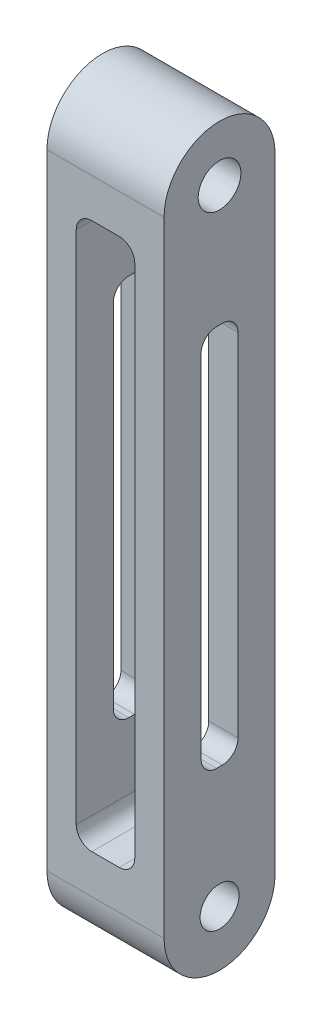
ISO-10303-21;
HEADER;
FILE_DESCRIPTION(('STEP AP214'),'2;1');
FILE_NAME('part.step','',(''),(''),'','','');
FILE_SCHEMA(('AUTOMOTIVE_DESIGN { 1 0 10303 214 1 1 1 1 }'));
ENDSEC;
DATA;
#1=APPLICATION_CONTEXT('core data for automotive mechanical design processes');
#2=APPLICATION_PROTOCOL_DEFINITION('international standard','automotive_design',2000,#1);
#3=PRODUCT_CONTEXT('',#1,'mechanical');
#4=PRODUCT('Part','Part','',(#3));
#5=PRODUCT_RELATED_PRODUCT_CATEGORY('part','',(#4));
#6=PRODUCT_DEFINITION_FORMATION('','',#4);
#7=PRODUCT_DEFINITION_CONTEXT('part definition',#1,'design');
#8=PRODUCT_DEFINITION('design','',#6,#7);
#9=PRODUCT_DEFINITION_SHAPE('','',#8);
#10=(LENGTH_UNIT() NAMED_UNIT(*) SI_UNIT(.MILLI.,.METRE.));
#11=(NAMED_UNIT(*) PLANE_ANGLE_UNIT() SI_UNIT($,.RADIAN.));
#12=(NAMED_UNIT(*) SI_UNIT($,.STERADIAN.) SOLID_ANGLE_UNIT());
#13=UNCERTAINTY_MEASURE_WITH_UNIT(LENGTH_MEASURE(1.E-05),#10,'distance_accuracy_value','');
#14=(GEOMETRIC_REPRESENTATION_CONTEXT(3) GLOBAL_UNCERTAINTY_ASSIGNED_CONTEXT((#13)) GLOBAL_UNIT_ASSIGNED_CONTEXT((#10,
#11,#12)) REPRESENTATION_CONTEXT('',''));
#15=CARTESIAN_POINT('',(0.,0.,0.));
#16=DIRECTION('',(0.,0.,1.));
#17=DIRECTION('',(1.,0.,0.));
#18=AXIS2_PLACEMENT_3D('',#15,#16,#17);
#19=CARTESIAN_POINT('',(15.,-15.5,0.));
#20=DIRECTION('',(0.,1.,0.));
#21=DIRECTION('',(0.,0.,1.));
#22=AXIS2_PLACEMENT_3D('',#19,#20,#21);
#23=PLANE('',#22);
#24=DIRECTION('',(0.,0.,-1.));
#25=VECTOR('',#24,1.);
#26=CARTESIAN_POINT('',(3.75,-15.5,0.));
#27=LINE('',#26,#25);
#28=CARTESIAN_POINT('',(3.75,-15.5,0.36620743934748));
#29=VERTEX_POINT('',#28);
#30=CARTESIAN_POINT('',(3.75,-15.5,-0.366207439347486));
#31=VERTEX_POINT('',#30);
#32=EDGE_CURVE('E344',#29,#31,#27,.T.);
#33=ORIENTED_EDGE('',*,*,#32,.F.);
#34=DIRECTION('',(-1.,0.,0.));
#35=VECTOR('',#34,1.);
#36=CARTESIAN_POINT('',(15.,-15.5,0.36620743934748));
#37=LINE('',#36,#35);
#38=CARTESIAN_POINT('',(0.,-15.5,0.36620743934748));
#39=VERTEX_POINT('',#38);
#40=EDGE_CURVE('E459',#29,#39,#37,.T.);
#41=ORIENTED_EDGE('',*,*,#40,.T.);
#42=DIRECTION('',(0.,0.,-1.));
#43=VECTOR('',#42,1.);
#44=CARTESIAN_POINT('',(0.,-15.5,0.));
#45=LINE('',#44,#43);
#46=CARTESIAN_POINT('',(0.,-15.5,-0.366207439347486));
#47=VERTEX_POINT('',#46);
#48=EDGE_CURVE('E419',#39,#47,#45,.T.);
#49=ORIENTED_EDGE('',*,*,#48,.T.);
#50=DIRECTION('',(-1.,0.,0.));
#51=VECTOR('',#50,1.);
#52=CARTESIAN_POINT('',(15.,-15.5,-0.366207439347486));
#53=LINE('',#52,#51);
#54=EDGE_CURVE('E489',#31,#47,#53,.T.);
#55=ORIENTED_EDGE('',*,*,#54,.F.);
#56=EDGE_LOOP('',(#33,#41,#49,#55));
#57=FACE_BOUND('',#56,.T.);
#58=ADVANCED_FACE('F47',(#57),#23,.F.);
#59=CARTESIAN_POINT('',(15.,-17.5,-0.366207439347486));
#60=DIRECTION('',(-1.,0.,0.));
#61=DIRECTION('',(0.,0.,1.));
#62=AXIS2_PLACEMENT_3D('',#59,#60,#61);
#63=CYLINDRICAL_SURFACE('',#62,2.);
#64=CARTESIAN_POINT('',(3.75,-17.5,-0.366207439347486));
#65=DIRECTION('',(1.,0.,0.));
#66=DIRECTION('',(0.,1.,0.));
#67=AXIS2_PLACEMENT_3D('',#64,#65,#66);
#68=CIRCLE('',#67,2.);
#69=CARTESIAN_POINT('',(3.75,-17.5,-2.36620743934749));
#70=VERTEX_POINT('',#69);
#71=EDGE_CURVE('E341',#31,#70,#68,.F.);
#72=ORIENTED_EDGE('',*,*,#71,.F.);
#73=ORIENTED_EDGE('',*,*,#54,.T.);
#74=CARTESIAN_POINT('',(0.,-17.5,-0.366207439347486));
#75=DIRECTION('',(1.,0.,0.));
#76=DIRECTION('',(0.,0.,-1.));
#77=AXIS2_PLACEMENT_3D('',#74,#75,#76);
#78=CIRCLE('',#77,2.);
#79=CARTESIAN_POINT('',(0.,-17.5,-2.36620743934749));
#80=VERTEX_POINT('',#79);
#81=EDGE_CURVE('E423',#47,#80,#78,.F.);
#82=ORIENTED_EDGE('',*,*,#81,.T.);
#83=DIRECTION('',(-1.,0.,0.));
#84=VECTOR('',#83,1.);
#85=CARTESIAN_POINT('',(15.,-17.5,-2.36620743934749));
#86=LINE('',#85,#84);
#87=EDGE_CURVE('E484',#70,#80,#86,.T.);
#88=ORIENTED_EDGE('',*,*,#87,.F.);
#89=EDGE_LOOP('',(#72,#73,#82,#88));
#90=FACE_BOUND('',#89,.T.);
#91=ADVANCED_FACE('F562',(#90),#63,.F.);
#92=CARTESIAN_POINT('',(15.,0.,-2.36620743934748));
#93=DIRECTION('',(0.,0.,-1.));
#94=DIRECTION('',(0.,1.,0.));
#95=AXIS2_PLACEMENT_3D('',#92,#93,#94);
#96=PLANE('',#95);
#97=DIRECTION('',(0.,-1.,0.));
#98=VECTOR('',#97,1.);
#99=CARTESIAN_POINT('',(3.75,0.,-2.36620743934748));
#100=LINE('',#99,#98);
#101=CARTESIAN_POINT('',(3.74999999999999,-62.5,-2.36620743934749));
#102=VERTEX_POINT('',#101);
#103=EDGE_CURVE('E338',#70,#102,#100,.T.);
#104=ORIENTED_EDGE('',*,*,#103,.F.);
#105=ORIENTED_EDGE('',*,*,#87,.T.);
#106=DIRECTION('',(0.,-1.,0.));
#107=VECTOR('',#106,1.);
#108=CARTESIAN_POINT('',(0.,0.,-2.36620743934748));
#109=LINE('',#108,#107);
#110=CARTESIAN_POINT('',(0.,-62.5,-2.36620743934749));
#111=VERTEX_POINT('',#110);
#112=EDGE_CURVE('E427',#80,#111,#109,.T.);
#113=ORIENTED_EDGE('',*,*,#112,.T.);
#114=DIRECTION('',(-1.,0.,0.));
#115=VECTOR('',#114,1.);
#116=CARTESIAN_POINT('',(15.,-62.5,-2.36620743934749));
#117=LINE('',#116,#115);
#118=EDGE_CURVE('E479',#102,#111,#117,.T.);
#119=ORIENTED_EDGE('',*,*,#118,.F.);
#120=EDGE_LOOP('',(#104,#105,#113,#119));
#121=FACE_BOUND('',#120,.T.);
#122=ADVANCED_FACE('F570',(#121),#96,.F.);
#123=CARTESIAN_POINT('',(15.,-62.5,-0.366207439347491));
#124=DIRECTION('',(-1.,0.,0.));
#125=DIRECTION('',(0.,0.,1.));
#126=AXIS2_PLACEMENT_3D('',#123,#124,#125);
#127=CYLINDRICAL_SURFACE('',#126,2.);
#128=DIRECTION('',(-1.,0.,0.));
#129=VECTOR('',#128,1.);
#130=CARTESIAN_POINT('',(15.,-64.5,-0.366207439347491));
#131=LINE('',#130,#129);
#132=CARTESIAN_POINT('',(3.74999999999999,-64.5,-0.366207439347491));
#133=VERTEX_POINT('',#132);
#134=CARTESIAN_POINT('',(0.,-64.5,-0.366207439347491));
#135=VERTEX_POINT('',#134);
#136=EDGE_CURVE('E474',#133,#135,#131,.T.);
#137=ORIENTED_EDGE('',*,*,#136,.F.);
#138=CARTESIAN_POINT('',(3.74999999999999,-62.5,-0.366207439347491));
#139=DIRECTION('',(1.,0.,0.));
#140=DIRECTION('',(0.,1.,0.));
#141=AXIS2_PLACEMENT_3D('',#138,#139,#140);
#142=CIRCLE('',#141,2.);
#143=EDGE_CURVE('E334',#133,#102,#142,.T.);
#144=ORIENTED_EDGE('',*,*,#143,.T.);
#145=ORIENTED_EDGE('',*,*,#118,.T.);
#146=CARTESIAN_POINT('',(0.,-62.5,-0.366207439347491));
#147=DIRECTION('',(1.,0.,0.));
#148=DIRECTION('',(0.,0.,-1.));
#149=AXIS2_PLACEMENT_3D('',#146,#147,#148);
#150=CIRCLE('',#149,2.);
#151=EDGE_CURVE('E431',#135,#111,#150,.T.);
#152=ORIENTED_EDGE('',*,*,#151,.F.);
#153=EDGE_LOOP('',(#137,#144,#145,#152));
#154=FACE_BOUND('',#153,.T.);
#155=ADVANCED_FACE('F622',(#154),#127,.F.);
#156=CARTESIAN_POINT('',(15.,-64.5,0.));
#157=DIRECTION('',(0.,1.,0.));
#158=DIRECTION('',(0.,0.,1.));
#159=AXIS2_PLACEMENT_3D('',#156,#157,#158);
#160=PLANE('',#159);
#161=DIRECTION('',(-1.,0.,0.));
#162=VECTOR('',#161,1.);
#163=CARTESIAN_POINT('',(15.,-64.5,0.366207439347474));
#164=LINE('',#163,#162);
#165=CARTESIAN_POINT('',(3.74999999999999,-64.5,0.366207439347474));
#166=VERTEX_POINT('',#165);
#167=CARTESIAN_POINT('',(0.,-64.5,0.366207439347474));
#168=VERTEX_POINT('',#167);
#169=EDGE_CURVE('E469',#166,#168,#164,.T.);
#170=ORIENTED_EDGE('',*,*,#169,.F.);
#171=DIRECTION('',(0.,0.,-1.));
#172=VECTOR('',#171,1.);
#173=CARTESIAN_POINT('',(3.74999999999999,-64.5,0.));
#174=LINE('',#173,#172);
#175=EDGE_CURVE('E330',#166,#133,#174,.T.);
#176=ORIENTED_EDGE('',*,*,#175,.T.);
#177=ORIENTED_EDGE('',*,*,#136,.T.);
#178=DIRECTION('',(0.,0.,-1.));
#179=VECTOR('',#178,1.);
#180=CARTESIAN_POINT('',(0.,-64.5,0.));
#181=LINE('',#180,#179);
#182=EDGE_CURVE('E435',#168,#135,#181,.T.);
#183=ORIENTED_EDGE('',*,*,#182,.F.);
#184=EDGE_LOOP('',(#170,#176,#177,#183));
#185=FACE_BOUND('',#184,.T.);
#186=ADVANCED_FACE('F628',(#185),#160,.T.);
#187=CARTESIAN_POINT('',(15.,-62.5,0.366207439347474));
#188=DIRECTION('',(-1.,0.,0.));
#189=DIRECTION('',(0.,0.,1.));
#190=AXIS2_PLACEMENT_3D('',#187,#188,#189);
#191=CYLINDRICAL_SURFACE('',#190,2.);
#192=CARTESIAN_POINT('',(3.74999999999999,-62.5,0.366207439347474));
#193=DIRECTION('',(1.,0.,0.));
#194=DIRECTION('',(0.,1.,0.));
#195=AXIS2_PLACEMENT_3D('',#192,#193,#194);
#196=CIRCLE('',#195,2.);
#197=CARTESIAN_POINT('',(3.74999999999999,-62.5,2.36620743934748));
#198=VERTEX_POINT('',#197);
#199=EDGE_CURVE('E327',#166,#198,#196,.F.);
#200=ORIENTED_EDGE('',*,*,#199,.F.);
#201=ORIENTED_EDGE('',*,*,#169,.T.);
#202=CARTESIAN_POINT('',(0.,-62.5,0.366207439347474));
#203=DIRECTION('',(1.,0.,0.));
#204=DIRECTION('',(0.,0.,-1.));
#205=AXIS2_PLACEMENT_3D('',#202,#203,#204);
#206=CIRCLE('',#205,2.);
#207=CARTESIAN_POINT('',(0.,-62.5,2.36620743934748));
#208=VERTEX_POINT('',#207);
#209=EDGE_CURVE('E439',#168,#208,#206,.F.);
#210=ORIENTED_EDGE('',*,*,#209,.T.);
#211=DIRECTION('',(-1.,0.,0.));
#212=VECTOR('',#211,1.);
#213=CARTESIAN_POINT('',(15.,-62.5,2.36620743934748));
#214=LINE('',#213,#212);
#215=EDGE_CURVE('E464',#198,#208,#214,.T.);
#216=ORIENTED_EDGE('',*,*,#215,.F.);
#217=EDGE_LOOP('',(#200,#201,#210,#216));
#218=FACE_BOUND('',#217,.T.);
#219=ADVANCED_FACE('F662',(#218),#191,.F.);
#220=CARTESIAN_POINT('',(15.,0.,2.36620743934748));
#221=DIRECTION('',(0.,0.,-1.));
#222=DIRECTION('',(0.,1.,0.));
#223=AXIS2_PLACEMENT_3D('',#220,#221,#222);
#224=PLANE('',#223);
#225=DIRECTION('',(-1.,0.,0.));
#226=VECTOR('',#225,1.);
#227=CARTESIAN_POINT('',(15.,-17.5,2.36620743934748));
#228=LINE('',#227,#226);
#229=CARTESIAN_POINT('',(3.75,-17.5,2.36620743934748));
#230=VERTEX_POINT('',#229);
#231=CARTESIAN_POINT('',(0.,-17.5,2.36620743934748));
#232=VERTEX_POINT('',#231);
#233=EDGE_CURVE('E458',#230,#232,#228,.T.);
#234=ORIENTED_EDGE('',*,*,#233,.F.);
#235=DIRECTION('',(0.,-1.,0.));
#236=VECTOR('',#235,1.);
#237=CARTESIAN_POINT('',(3.75,0.,2.36620743934748));
#238=LINE('',#237,#236);
#239=EDGE_CURVE('E323',#230,#198,#238,.T.);
#240=ORIENTED_EDGE('',*,*,#239,.T.);
#241=ORIENTED_EDGE('',*,*,#215,.T.);
#242=DIRECTION('',(0.,-1.,0.));
#243=VECTOR('',#242,1.);
#244=CARTESIAN_POINT('',(0.,0.,2.36620743934748));
#245=LINE('',#244,#243);
#246=EDGE_CURVE('E443',#232,#208,#245,.T.);
#247=ORIENTED_EDGE('',*,*,#246,.F.);
#248=EDGE_LOOP('',(#234,#240,#241,#247));
#249=FACE_BOUND('',#248,.T.);
#250=ADVANCED_FACE('F665',(#249),#224,.T.);
#251=CARTESIAN_POINT('',(15.,0.,-7.10864172703629));
#252=DIRECTION('',(0.,0.,-1.));
#253=DIRECTION('',(0.,1.,0.));
#254=AXIS2_PLACEMENT_3D('',#251,#252,#253);
#255=PLANE('',#254);
#256=DIRECTION('',(0.,-1.,0.));
#257=VECTOR('',#256,1.);
#258=CARTESIAN_POINT('',(0.,0.,-7.10864172703629));
#259=LINE('',#258,#257);
#260=CARTESIAN_POINT('',(0.,0.,-7.10864172703629));
#261=VERTEX_POINT('',#260);
#262=CARTESIAN_POINT('',(0.,-80.,-7.10864172703628));
#263=VERTEX_POINT('',#262);
#264=EDGE_CURVE('E350',#261,#263,#259,.T.);
#265=ORIENTED_EDGE('',*,*,#264,.F.);
#266=DIRECTION('',(-1.,0.,0.));
#267=VECTOR('',#266,1.);
#268=CARTESIAN_POINT('',(15.,0.,-7.10864172703629));
#269=LINE('',#268,#267);
#270=CARTESIAN_POINT('',(15.,0.,-7.10864172703629));
#271=VERTEX_POINT('',#270);
#272=EDGE_CURVE('E505',#271,#261,#269,.T.);
#273=ORIENTED_EDGE('',*,*,#272,.F.);
#274=DIRECTION('',(0.,-1.,0.));
#275=VECTOR('',#274,1.);
#276=CARTESIAN_POINT('',(15.,0.,-7.10864172703629));
#277=LINE('',#276,#275);
#278=CARTESIAN_POINT('',(15.,-80.,-7.10864172703628));
#279=VERTEX_POINT('',#278);
#280=EDGE_CURVE('E351',#271,#279,#277,.T.);
#281=ORIENTED_EDGE('',*,*,#280,.T.);
#282=DIRECTION('',(-1.,0.,0.));
#283=VECTOR('',#282,1.);
#284=CARTESIAN_POINT('',(15.,-80.,-7.10864172703628));
#285=LINE('',#284,#283);
#286=EDGE_CURVE('E401',#279,#263,#285,.T.);
#287=ORIENTED_EDGE('',*,*,#286,.T.);
#288=EDGE_LOOP('',(#265,#273,#281,#287));
#289=FACE_BOUND('',#288,.T.);
#290=CARTESIAN_POINT('',(5.75,-6.99999999999998,-7.10864172703629));
#291=DIRECTION('',(0.,0.,-1.));
#292=DIRECTION('',(0.,1.,0.));
#293=AXIS2_PLACEMENT_3D('',#290,#291,#292);
#294=CIRCLE('',#293,2.);
#295=CARTESIAN_POINT('',(3.75,-6.99999999999998,-7.10864172703629));
#296=VERTEX_POINT('',#295);
#297=CARTESIAN_POINT('',(5.75,-4.99999999999998,-7.10864172703629));
#298=VERTEX_POINT('',#297);
#299=EDGE_CURVE('E245',#296,#298,#294,.T.);
#300=ORIENTED_EDGE('',*,*,#299,.F.);
#301=DIRECTION('',(0.,-1.,0.));
#302=VECTOR('',#301,1.);
#303=CARTESIAN_POINT('',(3.75,0.,-7.10864172703629));
#304=LINE('',#303,#302);
#305=CARTESIAN_POINT('',(3.74999999999999,-73.,-7.10864172703628));
#306=VERTEX_POINT('',#305);
#307=EDGE_CURVE('E63',#296,#306,#304,.T.);
#308=ORIENTED_EDGE('',*,*,#307,.T.);
#309=CARTESIAN_POINT('',(5.74999999999999,-73.,-7.10864172703628));
#310=DIRECTION('',(0.,0.,-1.));
#311=DIRECTION('',(0.,1.,0.));
#312=AXIS2_PLACEMENT_3D('',#309,#310,#311);
#313=CIRCLE('',#312,2.);
#314=CARTESIAN_POINT('',(5.74999999999999,-75.,-7.10864172703628));
#315=VERTEX_POINT('',#314);
#316=EDGE_CURVE('E271',#306,#315,#313,.F.);
#317=ORIENTED_EDGE('',*,*,#316,.T.);
#318=DIRECTION('',(-1.,0.,0.));
#319=VECTOR('',#318,1.);
#320=CARTESIAN_POINT('',(0.,-75.,-7.10864172703628));
#321=LINE('',#320,#319);
#322=CARTESIAN_POINT('',(9.24999999999999,-75.,-7.10864172703628));
#323=VERTEX_POINT('',#322);
#324=EDGE_CURVE('E267',#323,#315,#321,.T.);
#325=ORIENTED_EDGE('',*,*,#324,.F.);
#326=CARTESIAN_POINT('',(9.24999999999999,-73.,-7.10864172703628));
#327=DIRECTION('',(0.,0.,-1.));
#328=DIRECTION('',(0.,1.,0.));
#329=AXIS2_PLACEMENT_3D('',#326,#327,#328);
#330=CIRCLE('',#329,2.);
#331=CARTESIAN_POINT('',(11.25,-73.,-7.10864172703628));
#332=VERTEX_POINT('',#331);
#333=EDGE_CURVE('E263',#332,#323,#330,.T.);
#334=ORIENTED_EDGE('',*,*,#333,.F.);
#335=DIRECTION('',(0.,-1.,0.));
#336=VECTOR('',#335,1.);
#337=CARTESIAN_POINT('',(11.25,0.,-7.10864172703629));
#338=LINE('',#337,#336);
#339=CARTESIAN_POINT('',(11.25,-6.99999999999998,-7.10864172703629));
#340=VERTEX_POINT('',#339);
#341=EDGE_CURVE('E256',#340,#332,#338,.T.);
#342=ORIENTED_EDGE('',*,*,#341,.F.);
#343=CARTESIAN_POINT('',(9.25,-6.99999999999998,-7.10864172703629));
#344=DIRECTION('',(0.,0.,-1.));
#345=DIRECTION('',(0.,1.,0.));
#346=AXIS2_PLACEMENT_3D('',#343,#344,#345);
#347=CIRCLE('',#346,2.);
#348=CARTESIAN_POINT('',(9.25,-4.99999999999998,-7.10864172703629));
#349=VERTEX_POINT('',#348);
#350=EDGE_CURVE('E252',#340,#349,#347,.F.);
#351=ORIENTED_EDGE('',*,*,#350,.T.);
#352=DIRECTION('',(-1.,0.,0.));
#353=VECTOR('',#352,1.);
#354=CARTESIAN_POINT('',(0.,-4.99999999999998,-7.10864172703629));
#355=LINE('',#354,#353);
#356=EDGE_CURVE('E235',#349,#298,#355,.T.);
#357=ORIENTED_EDGE('',*,*,#356,.T.);
#358=EDGE_LOOP('',(#300,#308,#317,#325,#334,#342,#351,#357));
#359=FACE_BOUND('',#358,.T.);
#360=ADVANCED_FACE('F49',(#289,#359),#255,.T.);
#361=CARTESIAN_POINT('',(15.,0.,7.10864172703629));
#362=DIRECTION('',(0.,0.,-1.));
#363=DIRECTION('',(0.,1.,0.));
#364=AXIS2_PLACEMENT_3D('',#361,#362,#363);
#365=PLANE('',#364);
#366=DIRECTION('',(0.,-1.,0.));
#367=VECTOR('',#366,1.);
#368=CARTESIAN_POINT('',(0.,0.,7.10864172703629));
#369=LINE('',#368,#367);
#370=CARTESIAN_POINT('',(0.,0.,7.10864172703629));
#371=VERTEX_POINT('',#370);
#372=CARTESIAN_POINT('',(0.,-80.,7.10864172703628));
#373=VERTEX_POINT('',#372);
#374=EDGE_CURVE('E408',#371,#373,#369,.T.);
#375=ORIENTED_EDGE('',*,*,#374,.T.);
#376=DIRECTION('',(-1.,0.,0.));
#377=VECTOR('',#376,1.);
#378=CARTESIAN_POINT('',(15.,-80.,7.10864172703628));
#379=LINE('',#378,#377);
#380=CARTESIAN_POINT('',(15.,-80.,7.10864172703628));
#381=VERTEX_POINT('',#380);
#382=EDGE_CURVE('E497',#381,#373,#379,.T.);
#383=ORIENTED_EDGE('',*,*,#382,.F.);
#384=DIRECTION('',(0.,-1.,0.));
#385=VECTOR('',#384,1.);
#386=CARTESIAN_POINT('',(15.,0.,7.10864172703629));
#387=LINE('',#386,#385);
#388=CARTESIAN_POINT('',(15.,0.,7.10864172703629));
#389=VERTEX_POINT('',#388);
#390=EDGE_CURVE('E359',#389,#381,#387,.T.);
#391=ORIENTED_EDGE('',*,*,#390,.F.);
#392=DIRECTION('',(-1.,0.,0.));
#393=VECTOR('',#392,1.);
#394=CARTESIAN_POINT('',(15.,0.,7.10864172703629));
#395=LINE('',#394,#393);
#396=EDGE_CURVE('E501',#389,#371,#395,.T.);
#397=ORIENTED_EDGE('',*,*,#396,.T.);
#398=EDGE_LOOP('',(#375,#383,#391,#397));
#399=FACE_BOUND('',#398,.T.);
#400=DIRECTION('',(0.,-1.,0.));
#401=VECTOR('',#400,1.);
#402=CARTESIAN_POINT('',(3.75,0.,7.10864172703629));
#403=LINE('',#402,#401);
#404=CARTESIAN_POINT('',(3.75,-6.99999999999998,7.10864172703629));
#405=VERTEX_POINT('',#404);
#406=CARTESIAN_POINT('',(3.74999999999999,-73.,7.10864172703628));
#407=VERTEX_POINT('',#406);
#408=EDGE_CURVE('E347',#405,#407,#403,.T.);
#409=ORIENTED_EDGE('',*,*,#408,.F.);
#410=CARTESIAN_POINT('',(5.75,-6.99999999999998,7.10864172703629));
#411=DIRECTION('',(0.,0.,-1.));
#412=DIRECTION('',(0.,1.,0.));
#413=AXIS2_PLACEMENT_3D('',#410,#411,#412);
#414=CIRCLE('',#413,2.);
#415=CARTESIAN_POINT('',(5.75,-4.99999999999998,7.10864172703629));
#416=VERTEX_POINT('',#415);
#417=EDGE_CURVE('E514',#405,#416,#414,.T.);
#418=ORIENTED_EDGE('',*,*,#417,.T.);
#419=DIRECTION('',(-1.,0.,0.));
#420=VECTOR('',#419,1.);
#421=CARTESIAN_POINT('',(15.,-4.99999999999998,7.10864172703629));
#422=LINE('',#421,#420);
#423=CARTESIAN_POINT('',(9.25,-4.99999999999998,7.10864172703628));
#424=VERTEX_POINT('',#423);
#425=EDGE_CURVE('E238',#424,#416,#422,.T.);
#426=ORIENTED_EDGE('',*,*,#425,.F.);
#427=CARTESIAN_POINT('',(9.25,-6.99999999999998,7.10864172703629));
#428=DIRECTION('',(0.,0.,-1.));
#429=DIRECTION('',(0.,1.,0.));
#430=AXIS2_PLACEMENT_3D('',#427,#428,#429);
#431=CIRCLE('',#430,2.);
#432=CARTESIAN_POINT('',(11.25,-6.99999999999998,7.10864172703629));
#433=VERTEX_POINT('',#432);
#434=EDGE_CURVE('E519',#433,#424,#431,.F.);
#435=ORIENTED_EDGE('',*,*,#434,.F.);
#436=DIRECTION('',(0.,-1.,0.));
#437=VECTOR('',#436,1.);
#438=CARTESIAN_POINT('',(11.25,0.,7.10864172703629));
#439=LINE('',#438,#437);
#440=CARTESIAN_POINT('',(11.25,-73.,7.10864172703628));
#441=VERTEX_POINT('',#440);
#442=EDGE_CURVE('E319',#433,#441,#439,.T.);
#443=ORIENTED_EDGE('',*,*,#442,.T.);
#444=CARTESIAN_POINT('',(9.24999999999999,-73.,7.10864172703628));
#445=DIRECTION('',(0.,0.,-1.));
#446=DIRECTION('',(0.,1.,0.));
#447=AXIS2_PLACEMENT_3D('',#444,#445,#446);
#448=CIRCLE('',#447,2.);
#449=CARTESIAN_POINT('',(9.24999999999999,-75.,7.10864172703628));
#450=VERTEX_POINT('',#449);
#451=EDGE_CURVE('E522',#441,#450,#448,.T.);
#452=ORIENTED_EDGE('',*,*,#451,.T.);
#453=DIRECTION('',(-1.,0.,0.));
#454=VECTOR('',#453,1.);
#455=CARTESIAN_POINT('',(15.,-75.,7.10864172703628));
#456=LINE('',#455,#454);
#457=CARTESIAN_POINT('',(5.74999999999999,-75.,7.10864172703628));
#458=VERTEX_POINT('',#457);
#459=EDGE_CURVE('E56',#450,#458,#456,.T.);
#460=ORIENTED_EDGE('',*,*,#459,.T.);
#461=CARTESIAN_POINT('',(5.74999999999999,-73.,7.10864172703628));
#462=DIRECTION('',(0.,0.,-1.));
#463=DIRECTION('',(0.,1.,0.));
#464=AXIS2_PLACEMENT_3D('',#461,#462,#463);
#465=CIRCLE('',#464,2.);
#466=EDGE_CURVE('E11',#407,#458,#465,.F.);
#467=ORIENTED_EDGE('',*,*,#466,.F.);
#468=EDGE_LOOP('',(#409,#418,#426,#435,#443,#452,#460,#467));
#469=FACE_BOUND('',#468,.T.);
#470=ADVANCED_FACE('F530',(#399,#469),#365,.F.);
#471=CARTESIAN_POINT('',(15.,-17.5,0.36620743934748));
#472=DIRECTION('',(-1.,0.,0.));
#473=DIRECTION('',(0.,0.,1.));
#474=AXIS2_PLACEMENT_3D('',#471,#472,#473);
#475=CYLINDRICAL_SURFACE('',#474,2.);
#476=CARTESIAN_POINT('',(3.75,-17.5,0.36620743934748));
#477=DIRECTION('',(1.,0.,0.));
#478=DIRECTION('',(0.,1.,0.));
#479=AXIS2_PLACEMENT_3D('',#476,#477,#478);
#480=CIRCLE('',#479,2.);
#481=EDGE_CURVE('E511',#230,#29,#480,.F.);
#482=ORIENTED_EDGE('',*,*,#481,.F.);
#483=ORIENTED_EDGE('',*,*,#233,.T.);
#484=CARTESIAN_POINT('',(0.,-17.5,0.36620743934748));
#485=DIRECTION('',(1.,0.,0.));
#486=DIRECTION('',(0.,0.,-1.));
#487=AXIS2_PLACEMENT_3D('',#484,#485,#486);
#488=CIRCLE('',#487,2.);
#489=EDGE_CURVE('E447',#232,#39,#488,.F.);
#490=ORIENTED_EDGE('',*,*,#489,.T.);
#491=ORIENTED_EDGE('',*,*,#40,.F.);
#492=EDGE_LOOP('',(#482,#483,#490,#491));
#493=FACE_BOUND('',#492,.T.);
#494=ADVANCED_FACE('F577',(#493),#475,.F.);
#495=CARTESIAN_POINT('',(15.,-15.5,0.36620743934748));
#496=VERTEX_POINT('',#495);
#497=CARTESIAN_POINT('',(11.25,-15.5,0.36620743934748));
#498=VERTEX_POINT('',#497);
#499=EDGE_CURVE('E454',#496,#498,#37,.T.);
#500=ORIENTED_EDGE('',*,*,#499,.T.);
#501=DIRECTION('',(0.,0.,-1.));
#502=VECTOR('',#501,1.);
#503=CARTESIAN_POINT('',(11.25,-15.5,0.));
#504=LINE('',#503,#502);
#505=CARTESIAN_POINT('',(11.25,-15.5,-0.366207439347486));
#506=VERTEX_POINT('',#505);
#507=EDGE_CURVE('E315',#498,#506,#504,.T.);
#508=ORIENTED_EDGE('',*,*,#507,.T.);
#509=CARTESIAN_POINT('',(15.,-15.5,-0.366207439347486));
#510=VERTEX_POINT('',#509);
#511=EDGE_CURVE('E490',#510,#506,#53,.T.);
#512=ORIENTED_EDGE('',*,*,#511,.F.);
#513=DIRECTION('',(0.,0.,-1.));
#514=VECTOR('',#513,1.);
#515=CARTESIAN_POINT('',(15.,-15.5,0.));
#516=LINE('',#515,#514);
#517=EDGE_CURVE('E369',#496,#510,#516,.T.);
#518=ORIENTED_EDGE('',*,*,#517,.F.);
#519=EDGE_LOOP('',(#500,#508,#512,#518));
#520=FACE_BOUND('',#519,.T.);
#521=ADVANCED_FACE('F565',(#520),#23,.F.);
#522=ORIENTED_EDGE('',*,*,#511,.T.);
#523=CARTESIAN_POINT('',(11.25,-17.5,-0.366207439347486));
#524=DIRECTION('',(1.,0.,0.));
#525=DIRECTION('',(0.,1.,0.));
#526=AXIS2_PLACEMENT_3D('',#523,#524,#525);
#527=CIRCLE('',#526,2.);
#528=CARTESIAN_POINT('',(11.25,-17.5,-2.36620743934749));
#529=VERTEX_POINT('',#528);
#530=EDGE_CURVE('E311',#506,#529,#527,.F.);
#531=ORIENTED_EDGE('',*,*,#530,.T.);
#532=CARTESIAN_POINT('',(15.,-17.5,-2.36620743934749));
#533=VERTEX_POINT('',#532);
#534=EDGE_CURVE('E485',#533,#529,#86,.T.);
#535=ORIENTED_EDGE('',*,*,#534,.F.);
#536=CARTESIAN_POINT('',(15.,-17.5,-0.366207439347486));
#537=DIRECTION('',(1.,0.,0.));
#538=DIRECTION('',(0.,0.,-1.));
#539=AXIS2_PLACEMENT_3D('',#536,#537,#538);
#540=CIRCLE('',#539,2.);
#541=EDGE_CURVE('E373',#510,#533,#540,.F.);
#542=ORIENTED_EDGE('',*,*,#541,.F.);
#543=EDGE_LOOP('',(#522,#531,#535,#542));
#544=FACE_BOUND('',#543,.T.);
#545=ADVANCED_FACE('F573',(#544),#63,.F.);
#546=ORIENTED_EDGE('',*,*,#534,.T.);
#547=DIRECTION('',(0.,-1.,0.));
#548=VECTOR('',#547,1.);
#549=CARTESIAN_POINT('',(11.25,0.,-2.36620743934748));
#550=LINE('',#549,#548);
#551=CARTESIAN_POINT('',(11.25,-62.5,-2.36620743934749));
#552=VERTEX_POINT('',#551);
#553=EDGE_CURVE('E307',#529,#552,#550,.T.);
#554=ORIENTED_EDGE('',*,*,#553,.T.);
#555=CARTESIAN_POINT('',(15.,-62.5,-2.36620743934749));
#556=VERTEX_POINT('',#555);
#557=EDGE_CURVE('E480',#556,#552,#117,.T.);
#558=ORIENTED_EDGE('',*,*,#557,.F.);
#559=DIRECTION('',(0.,-1.,0.));
#560=VECTOR('',#559,1.);
#561=CARTESIAN_POINT('',(15.,0.,-2.36620743934748));
#562=LINE('',#561,#560);
#563=EDGE_CURVE('E376',#533,#556,#562,.T.);
#564=ORIENTED_EDGE('',*,*,#563,.F.);
#565=EDGE_LOOP('',(#546,#554,#558,#564));
#566=FACE_BOUND('',#565,.T.);
#567=ADVANCED_FACE('F583',(#566),#96,.F.);
#568=CARTESIAN_POINT('',(11.25,-62.5,-0.366207439347491));
#569=DIRECTION('',(1.,0.,0.));
#570=DIRECTION('',(0.,1.,0.));
#571=AXIS2_PLACEMENT_3D('',#568,#569,#570);
#572=CIRCLE('',#571,2.);
#573=CARTESIAN_POINT('',(11.25,-64.5,-0.366207439347491));
#574=VERTEX_POINT('',#573);
#575=EDGE_CURVE('E304',#574,#552,#572,.T.);
#576=ORIENTED_EDGE('',*,*,#575,.F.);
#577=CARTESIAN_POINT('',(15.,-64.5,-0.366207439347491));
#578=VERTEX_POINT('',#577);
#579=EDGE_CURVE('E475',#578,#574,#131,.T.);
#580=ORIENTED_EDGE('',*,*,#579,.F.);
#581=CARTESIAN_POINT('',(15.,-62.5,-0.366207439347491));
#582=DIRECTION('',(1.,0.,0.));
#583=DIRECTION('',(0.,0.,-1.));
#584=AXIS2_PLACEMENT_3D('',#581,#582,#583);
#585=CIRCLE('',#584,2.);
#586=EDGE_CURVE('E379',#578,#556,#585,.T.);
#587=ORIENTED_EDGE('',*,*,#586,.T.);
#588=ORIENTED_EDGE('',*,*,#557,.T.);
#589=EDGE_LOOP('',(#576,#580,#587,#588));
#590=FACE_BOUND('',#589,.T.);
#591=ADVANCED_FACE('F608',(#590),#127,.F.);
#592=DIRECTION('',(0.,0.,-1.));
#593=VECTOR('',#592,1.);
#594=CARTESIAN_POINT('',(11.25,-64.5,0.));
#595=LINE('',#594,#593);
#596=CARTESIAN_POINT('',(11.25,-64.5,0.366207439347474));
#597=VERTEX_POINT('',#596);
#598=EDGE_CURVE('E301',#597,#574,#595,.T.);
#599=ORIENTED_EDGE('',*,*,#598,.F.);
#600=CARTESIAN_POINT('',(15.,-64.5,0.366207439347474));
#601=VERTEX_POINT('',#600);
#602=EDGE_CURVE('E470',#601,#597,#164,.T.);
#603=ORIENTED_EDGE('',*,*,#602,.F.);
#604=DIRECTION('',(0.,0.,-1.));
#605=VECTOR('',#604,1.);
#606=CARTESIAN_POINT('',(15.,-64.5,0.));
#607=LINE('',#606,#605);
#608=EDGE_CURVE('E383',#601,#578,#607,.T.);
#609=ORIENTED_EDGE('',*,*,#608,.T.);
#610=ORIENTED_EDGE('',*,*,#579,.T.);
#611=EDGE_LOOP('',(#599,#603,#609,#610));
#612=FACE_BOUND('',#611,.T.);
#613=ADVANCED_FACE('F605',(#612),#160,.T.);
#614=ORIENTED_EDGE('',*,*,#602,.T.);
#615=CARTESIAN_POINT('',(11.25,-62.5,0.366207439347474));
#616=DIRECTION('',(1.,0.,0.));
#617=DIRECTION('',(0.,1.,0.));
#618=AXIS2_PLACEMENT_3D('',#615,#616,#617);
#619=CIRCLE('',#618,2.);
#620=CARTESIAN_POINT('',(11.25,-62.5,2.36620743934748));
#621=VERTEX_POINT('',#620);
#622=EDGE_CURVE('E297',#597,#621,#619,.F.);
#623=ORIENTED_EDGE('',*,*,#622,.T.);
#624=CARTESIAN_POINT('',(15.,-62.5,2.36620743934748));
#625=VERTEX_POINT('',#624);
#626=EDGE_CURVE('E465',#625,#621,#214,.T.);
#627=ORIENTED_EDGE('',*,*,#626,.F.);
#628=CARTESIAN_POINT('',(15.,-62.5,0.366207439347474));
#629=DIRECTION('',(1.,0.,0.));
#630=DIRECTION('',(0.,0.,-1.));
#631=AXIS2_PLACEMENT_3D('',#628,#629,#630);
#632=CIRCLE('',#631,2.);
#633=EDGE_CURVE('E387',#601,#625,#632,.F.);
#634=ORIENTED_EDGE('',*,*,#633,.F.);
#635=EDGE_LOOP('',(#614,#623,#627,#634));
#636=FACE_BOUND('',#635,.T.);
#637=ADVANCED_FACE('F600',(#636),#191,.F.);
#638=DIRECTION('',(0.,-1.,0.));
#639=VECTOR('',#638,1.);
#640=CARTESIAN_POINT('',(11.25,0.,2.36620743934748));
#641=LINE('',#640,#639);
#642=CARTESIAN_POINT('',(11.25,-17.5,2.36620743934748));
#643=VERTEX_POINT('',#642);
#644=EDGE_CURVE('E278',#643,#621,#641,.T.);
#645=ORIENTED_EDGE('',*,*,#644,.F.);
#646=CARTESIAN_POINT('',(15.,-17.5,2.36620743934748));
#647=VERTEX_POINT('',#646);
#648=EDGE_CURVE('E460',#647,#643,#228,.T.);
#649=ORIENTED_EDGE('',*,*,#648,.F.);
#650=DIRECTION('',(0.,-1.,0.));
#651=VECTOR('',#650,1.);
#652=CARTESIAN_POINT('',(15.,0.,2.36620743934748));
#653=LINE('',#652,#651);
#654=EDGE_CURVE('E390',#647,#625,#653,.T.);
#655=ORIENTED_EDGE('',*,*,#654,.T.);
#656=ORIENTED_EDGE('',*,*,#626,.T.);
#657=EDGE_LOOP('',(#645,#649,#655,#656));
#658=FACE_BOUND('',#657,.T.);
#659=ADVANCED_FACE('F596',(#658),#224,.T.);
#660=CARTESIAN_POINT('',(15.,0.,0.));
#661=DIRECTION('',(-1.,0.,0.));
#662=DIRECTION('',(0.,0.,1.));
#663=AXIS2_PLACEMENT_3D('',#660,#661,#662);
#664=CYLINDRICAL_SURFACE('',#663,7.10864172703629);
#665=CARTESIAN_POINT('',(0.,0.,0.));
#666=DIRECTION('',(1.,0.,0.));
#667=DIRECTION('',(0.,0.,-1.));
#668=AXIS2_PLACEMENT_3D('',#665,#666,#667);
#669=CIRCLE('',#668,7.10864172703629);
#670=EDGE_CURVE('E405',#261,#371,#669,.T.);
#671=ORIENTED_EDGE('',*,*,#670,.T.);
#672=ORIENTED_EDGE('',*,*,#396,.F.);
#673=CARTESIAN_POINT('',(15.,0.,0.));
#674=DIRECTION('',(1.,0.,0.));
#675=DIRECTION('',(0.,0.,-1.));
#676=AXIS2_PLACEMENT_3D('',#673,#674,#675);
#677=CIRCLE('',#676,7.10864172703629);
#678=EDGE_CURVE('E355',#271,#389,#677,.T.);
#679=ORIENTED_EDGE('',*,*,#678,.F.);
#680=ORIENTED_EDGE('',*,*,#272,.T.);
#681=EDGE_LOOP('',(#671,#672,#679,#680));
#682=FACE_BOUND('',#681,.T.);
#683=ADVANCED_FACE('F675',(#682),#664,.T.);
#684=ORIENTED_EDGE('',*,*,#648,.T.);
#685=CARTESIAN_POINT('',(11.25,-17.5,0.36620743934748));
#686=DIRECTION('',(1.,0.,0.));
#687=DIRECTION('',(0.,1.,0.));
#688=AXIS2_PLACEMENT_3D('',#685,#686,#687);
#689=CIRCLE('',#688,2.);
#690=EDGE_CURVE('E494',#643,#498,#689,.F.);
#691=ORIENTED_EDGE('',*,*,#690,.T.);
#692=ORIENTED_EDGE('',*,*,#499,.F.);
#693=CARTESIAN_POINT('',(15.,-17.5,0.36620743934748));
#694=DIRECTION('',(1.,0.,0.));
#695=DIRECTION('',(0.,0.,-1.));
#696=AXIS2_PLACEMENT_3D('',#693,#694,#695);
#697=CIRCLE('',#696,2.);
#698=EDGE_CURVE('E394',#647,#496,#697,.F.);
#699=ORIENTED_EDGE('',*,*,#698,.F.);
#700=EDGE_LOOP('',(#684,#691,#692,#699));
#701=FACE_BOUND('',#700,.T.);
#702=ADVANCED_FACE('F587',(#701),#475,.F.);
#703=CARTESIAN_POINT('',(15.,-80.,0.));
#704=DIRECTION('',(-1.,0.,0.));
#705=DIRECTION('',(0.,0.,1.));
#706=AXIS2_PLACEMENT_3D('',#703,#704,#705);
#707=CYLINDRICAL_SURFACE('',#706,2.5);
#708=CARTESIAN_POINT('',(15.,-80.,0.));
#709=DIRECTION('',(1.,0.,0.));
#710=DIRECTION('',(0.,0.,-1.));
#711=AXIS2_PLACEMENT_3D('',#708,#709,#710);
#712=CIRCLE('',#711,2.5);
#713=CARTESIAN_POINT('',(15.,-80.,-2.50000000000001));
#714=VERTEX_POINT('',#713);
#715=EDGE_CURVE('E365',#714,#714,#712,.T.);
#716=ORIENTED_EDGE('',*,*,#715,.T.);
#717=EDGE_LOOP('',(#716));
#718=FACE_BOUND('',#717,.T.);
#719=CARTESIAN_POINT('',(0.,-80.,0.));
#720=DIRECTION('',(1.,0.,0.));
#721=DIRECTION('',(0.,0.,-1.));
#722=AXIS2_PLACEMENT_3D('',#719,#720,#721);
#723=CIRCLE('',#722,2.5);
#724=CARTESIAN_POINT('',(0.,-80.,-2.50000000000001));
#725=VERTEX_POINT('',#724);
#726=EDGE_CURVE('E415',#725,#725,#723,.T.);
#727=ORIENTED_EDGE('',*,*,#726,.F.);
#728=EDGE_LOOP('',(#727));
#729=FACE_BOUND('',#728,.T.);
#730=ADVANCED_FACE('F760',(#718,#729),#707,.F.);
#731=CARTESIAN_POINT('',(15.,-80.,0.));
#732=DIRECTION('',(-1.,0.,0.));
#733=DIRECTION('',(0.,0.,1.));
#734=AXIS2_PLACEMENT_3D('',#731,#732,#733);
#735=CYLINDRICAL_SURFACE('',#734,7.10864172703628);
#736=CARTESIAN_POINT('',(0.,-80.,0.));
#737=DIRECTION('',(1.,0.,0.));
#738=DIRECTION('',(0.,0.,-1.));
#739=AXIS2_PLACEMENT_3D('',#736,#737,#738);
#740=CIRCLE('',#739,7.10864172703628);
#741=EDGE_CURVE('E411',#373,#263,#740,.T.);
#742=ORIENTED_EDGE('',*,*,#741,.T.);
#743=ORIENTED_EDGE('',*,*,#286,.F.);
#744=CARTESIAN_POINT('',(15.,-80.,0.));
#745=DIRECTION('',(1.,0.,0.));
#746=DIRECTION('',(0.,0.,-1.));
#747=AXIS2_PLACEMENT_3D('',#744,#745,#746);
#748=CIRCLE('',#747,7.10864172703628);
#749=EDGE_CURVE('E362',#381,#279,#748,.T.);
#750=ORIENTED_EDGE('',*,*,#749,.F.);
#751=ORIENTED_EDGE('',*,*,#382,.T.);
#752=EDGE_LOOP('',(#742,#743,#750,#751));
#753=FACE_BOUND('',#752,.T.);
#754=ADVANCED_FACE('F750',(#753),#735,.T.);
#755=CARTESIAN_POINT('',(15.,0.,0.));
#756=DIRECTION('',(-1.,0.,0.));
#757=DIRECTION('',(0.,0.,1.));
#758=AXIS2_PLACEMENT_3D('',#755,#756,#757);
#759=CYLINDRICAL_SURFACE('',#758,2.73409297193703);
#760=CARTESIAN_POINT('',(15.,0.,0.));
#761=DIRECTION('',(1.,0.,0.));
#762=DIRECTION('',(0.,0.,-1.));
#763=AXIS2_PLACEMENT_3D('',#760,#761,#762);
#764=CIRCLE('',#763,2.73409297193703);
#765=CARTESIAN_POINT('',(15.,0.,-2.73409297193703));
#766=VERTEX_POINT('',#765);
#767=EDGE_CURVE('E397',#766,#766,#764,.T.);
#768=ORIENTED_EDGE('',*,*,#767,.T.);
#769=EDGE_LOOP('',(#768));
#770=FACE_BOUND('',#769,.T.);
#771=CARTESIAN_POINT('',(0.,0.,0.));
#772=DIRECTION('',(1.,0.,0.));
#773=DIRECTION('',(0.,0.,-1.));
#774=AXIS2_PLACEMENT_3D('',#771,#772,#773);
#775=CIRCLE('',#774,2.73409297193703);
#776=CARTESIAN_POINT('',(0.,0.,-2.73409297193703));
#777=VERTEX_POINT('',#776);
#778=EDGE_CURVE('E356',#777,#777,#775,.T.);
#779=ORIENTED_EDGE('',*,*,#778,.F.);
#780=EDGE_LOOP('',(#779));
#781=FACE_BOUND('',#780,.T.);
#782=ADVANCED_FACE('F740',(#770,#781),#759,.F.);
#783=CARTESIAN_POINT('',(15.,0.,0.));
#784=DIRECTION('',(1.,0.,0.));
#785=DIRECTION('',(0.,0.,-1.));
#786=AXIS2_PLACEMENT_3D('',#783,#784,#785);
#787=PLANE('',#786);
#788=ORIENTED_EDGE('',*,*,#280,.F.);
#789=ORIENTED_EDGE('',*,*,#678,.T.);
#790=ORIENTED_EDGE('',*,*,#390,.T.);
#791=ORIENTED_EDGE('',*,*,#749,.T.);
#792=EDGE_LOOP('',(#788,#789,#790,#791));
#793=FACE_BOUND('',#792,.T.);
#794=ORIENTED_EDGE('',*,*,#715,.F.);
#795=EDGE_LOOP('',(#794));
#796=FACE_BOUND('',#795,.T.);
#797=ORIENTED_EDGE('',*,*,#517,.T.);
#798=ORIENTED_EDGE('',*,*,#541,.T.);
#799=ORIENTED_EDGE('',*,*,#563,.T.);
#800=ORIENTED_EDGE('',*,*,#586,.F.);
#801=ORIENTED_EDGE('',*,*,#608,.F.);
#802=ORIENTED_EDGE('',*,*,#633,.T.);
#803=ORIENTED_EDGE('',*,*,#654,.F.);
#804=ORIENTED_EDGE('',*,*,#698,.T.);
#805=EDGE_LOOP('',(#797,#798,#799,#800,#801,#802,#803,#804));
#806=FACE_BOUND('',#805,.T.);
#807=ORIENTED_EDGE('',*,*,#767,.F.);
#808=EDGE_LOOP('',(#807));
#809=FACE_BOUND('',#808,.T.);
#810=ADVANCED_FACE('F610',(#793,#796,#806,#809),#787,.T.);
#811=CARTESIAN_POINT('',(0.,0.,0.));
#812=DIRECTION('',(1.,0.,0.));
#813=DIRECTION('',(0.,0.,-1.));
#814=AXIS2_PLACEMENT_3D('',#811,#812,#813);
#815=PLANE('',#814);
#816=ORIENTED_EDGE('',*,*,#264,.T.);
#817=ORIENTED_EDGE('',*,*,#741,.F.);
#818=ORIENTED_EDGE('',*,*,#374,.F.);
#819=ORIENTED_EDGE('',*,*,#670,.F.);
#820=EDGE_LOOP('',(#816,#817,#818,#819));
#821=FACE_BOUND('',#820,.T.);
#822=ORIENTED_EDGE('',*,*,#726,.T.);
#823=EDGE_LOOP('',(#822));
#824=FACE_BOUND('',#823,.T.);
#825=ORIENTED_EDGE('',*,*,#48,.F.);
#826=ORIENTED_EDGE('',*,*,#489,.F.);
#827=ORIENTED_EDGE('',*,*,#246,.T.);
#828=ORIENTED_EDGE('',*,*,#209,.F.);
#829=ORIENTED_EDGE('',*,*,#182,.T.);
#830=ORIENTED_EDGE('',*,*,#151,.T.);
#831=ORIENTED_EDGE('',*,*,#112,.F.);
#832=ORIENTED_EDGE('',*,*,#81,.F.);
#833=EDGE_LOOP('',(#825,#826,#827,#828,#829,#830,#831,#832));
#834=FACE_BOUND('',#833,.T.);
#835=ORIENTED_EDGE('',*,*,#778,.T.);
#836=EDGE_LOOP('',(#835));
#837=FACE_BOUND('',#836,.T.);
#838=ADVANCED_FACE('F652',(#821,#824,#834,#837),#815,.F.);
#839=CARTESIAN_POINT('',(5.74999999999999,-73.,22.8913582729637));
#840=DIRECTION('',(0.,0.,-1.));
#841=DIRECTION('',(0.,1.,0.));
#842=AXIS2_PLACEMENT_3D('',#839,#840,#841);
#843=CYLINDRICAL_SURFACE('',#842,2.);
#844=ORIENTED_EDGE('',*,*,#466,.T.);
#845=DIRECTION('',(0.,0.,-1.));
#846=VECTOR('',#845,1.);
#847=CARTESIAN_POINT('',(5.74999999999999,-75.,22.8913582729637));
#848=LINE('',#847,#846);
#849=EDGE_CURVE('E279',#458,#315,#848,.T.);
#850=ORIENTED_EDGE('',*,*,#849,.T.);
#851=ORIENTED_EDGE('',*,*,#316,.F.);
#852=DIRECTION('',(0.,0.,-1.));
#853=VECTOR('',#852,1.);
#854=CARTESIAN_POINT('',(3.74999999999999,-73.,22.8913582729637));
#855=LINE('',#854,#853);
#856=EDGE_CURVE('E275',#407,#306,#855,.T.);
#857=ORIENTED_EDGE('',*,*,#856,.F.);
#858=EDGE_LOOP('',(#844,#850,#851,#857));
#859=FACE_BOUND('',#858,.T.);
#860=ADVANCED_FACE('F543',(#859),#843,.F.);
#861=CARTESIAN_POINT('',(0.,-75.,22.8913582729637));
#862=DIRECTION('',(0.,-1.,0.));
#863=DIRECTION('',(0.,0.,-1.));
#864=AXIS2_PLACEMENT_3D('',#861,#862,#863);
#865=PLANE('',#864);
#866=DIRECTION('',(0.,0.,-1.));
#867=VECTOR('',#866,1.);
#868=CARTESIAN_POINT('',(9.24999999999999,-75.,22.8913582729637));
#869=LINE('',#868,#867);
#870=EDGE_CURVE('E282',#450,#323,#869,.T.);
#871=ORIENTED_EDGE('',*,*,#870,.T.);
#872=ORIENTED_EDGE('',*,*,#324,.T.);
#873=ORIENTED_EDGE('',*,*,#849,.F.);
#874=ORIENTED_EDGE('',*,*,#459,.F.);
#875=EDGE_LOOP('',(#871,#872,#873,#874));
#876=FACE_BOUND('',#875,.T.);
#877=ADVANCED_FACE('F534',(#876),#865,.F.);
#878=CARTESIAN_POINT('',(9.24999999999999,-73.,22.8913582729637));
#879=DIRECTION('',(0.,0.,-1.));
#880=DIRECTION('',(0.,1.,0.));
#881=AXIS2_PLACEMENT_3D('',#878,#879,#880);
#882=CYLINDRICAL_SURFACE('',#881,2.);
#883=DIRECTION('',(0.,0.,-1.));
#884=VECTOR('',#883,1.);
#885=CARTESIAN_POINT('',(11.25,-73.,22.8913582729637));
#886=LINE('',#885,#884);
#887=EDGE_CURVE('E285',#441,#332,#886,.T.);
#888=ORIENTED_EDGE('',*,*,#887,.T.);
#889=ORIENTED_EDGE('',*,*,#333,.T.);
#890=ORIENTED_EDGE('',*,*,#870,.F.);
#891=ORIENTED_EDGE('',*,*,#451,.F.);
#892=EDGE_LOOP('',(#888,#889,#890,#891));
#893=FACE_BOUND('',#892,.T.);
#894=ADVANCED_FACE('F536',(#893),#882,.F.);
#895=CARTESIAN_POINT('',(9.25,-6.99999999999998,22.8913582729637));
#896=DIRECTION('',(0.,0.,-1.));
#897=DIRECTION('',(0.,1.,0.));
#898=AXIS2_PLACEMENT_3D('',#895,#896,#897);
#899=CYLINDRICAL_SURFACE('',#898,2.);
#900=ORIENTED_EDGE('',*,*,#434,.T.);
#901=DIRECTION('',(0.,0.,-1.));
#902=VECTOR('',#901,1.);
#903=CARTESIAN_POINT('',(9.25,-4.99999999999998,22.8913582729637));
#904=LINE('',#903,#902);
#905=EDGE_CURVE('E241',#424,#349,#904,.T.);
#906=ORIENTED_EDGE('',*,*,#905,.T.);
#907=ORIENTED_EDGE('',*,*,#350,.F.);
#908=DIRECTION('',(0.,0.,-1.));
#909=VECTOR('',#908,1.);
#910=CARTESIAN_POINT('',(11.25,-6.99999999999998,22.8913582729637));
#911=LINE('',#910,#909);
#912=EDGE_CURVE('E288',#433,#340,#911,.T.);
#913=ORIENTED_EDGE('',*,*,#912,.F.);
#914=EDGE_LOOP('',(#900,#906,#907,#913));
#915=FACE_BOUND('',#914,.T.);
#916=ADVANCED_FACE('F548',(#915),#899,.F.);
#917=CARTESIAN_POINT('',(0.,-4.99999999999998,22.8913582729637));
#918=DIRECTION('',(0.,-1.,0.));
#919=DIRECTION('',(0.,0.,-1.));
#920=AXIS2_PLACEMENT_3D('',#917,#918,#919);
#921=PLANE('',#920);
#922=ORIENTED_EDGE('',*,*,#425,.T.);
#923=DIRECTION('',(0.,0.,-1.));
#924=VECTOR('',#923,1.);
#925=CARTESIAN_POINT('',(5.75,-4.99999999999998,22.8913582729637));
#926=LINE('',#925,#924);
#927=EDGE_CURVE('E71',#416,#298,#926,.T.);
#928=ORIENTED_EDGE('',*,*,#927,.T.);
#929=ORIENTED_EDGE('',*,*,#356,.F.);
#930=ORIENTED_EDGE('',*,*,#905,.F.);
#931=EDGE_LOOP('',(#922,#928,#929,#930));
#932=FACE_BOUND('',#931,.T.);
#933=ADVANCED_FACE('F232',(#932),#921,.T.);
#934=CARTESIAN_POINT('',(5.75,-6.99999999999998,22.8913582729637));
#935=DIRECTION('',(0.,0.,-1.));
#936=DIRECTION('',(0.,1.,0.));
#937=AXIS2_PLACEMENT_3D('',#934,#935,#936);
#938=CYLINDRICAL_SURFACE('',#937,2.);
#939=DIRECTION('',(0.,0.,-1.));
#940=VECTOR('',#939,1.);
#941=CARTESIAN_POINT('',(3.75,-6.99999999999998,22.8913582729637));
#942=LINE('',#941,#940);
#943=EDGE_CURVE('E242',#405,#296,#942,.T.);
#944=ORIENTED_EDGE('',*,*,#943,.T.);
#945=ORIENTED_EDGE('',*,*,#299,.T.);
#946=ORIENTED_EDGE('',*,*,#927,.F.);
#947=ORIENTED_EDGE('',*,*,#417,.F.);
#948=EDGE_LOOP('',(#944,#945,#946,#947));
#949=FACE_BOUND('',#948,.T.);
#950=ADVANCED_FACE('F246',(#949),#938,.F.);
#951=CARTESIAN_POINT('',(3.75,0.,22.8913582729637));
#952=DIRECTION('',(1.,0.,0.));
#953=DIRECTION('',(0.,1.,0.));
#954=AXIS2_PLACEMENT_3D('',#951,#952,#953);
#955=PLANE('',#954);
#956=ORIENTED_EDGE('',*,*,#32,.T.);
#957=ORIENTED_EDGE('',*,*,#71,.T.);
#958=ORIENTED_EDGE('',*,*,#103,.T.);
#959=ORIENTED_EDGE('',*,*,#143,.F.);
#960=ORIENTED_EDGE('',*,*,#175,.F.);
#961=ORIENTED_EDGE('',*,*,#199,.T.);
#962=ORIENTED_EDGE('',*,*,#239,.F.);
#963=ORIENTED_EDGE('',*,*,#481,.T.);
#964=EDGE_LOOP('',(#956,#957,#958,#959,#960,#961,#962,#963));
#965=FACE_BOUND('',#964,.T.);
#966=ORIENTED_EDGE('',*,*,#408,.T.);
#967=ORIENTED_EDGE('',*,*,#856,.T.);
#968=ORIENTED_EDGE('',*,*,#307,.F.);
#969=ORIENTED_EDGE('',*,*,#943,.F.);
#970=EDGE_LOOP('',(#966,#967,#968,#969));
#971=FACE_BOUND('',#970,.T.);
#972=ADVANCED_FACE('F544',(#965,#971),#955,.T.);
#973=CARTESIAN_POINT('',(11.25,0.,22.8913582729637));
#974=DIRECTION('',(1.,0.,0.));
#975=DIRECTION('',(0.,1.,0.));
#976=AXIS2_PLACEMENT_3D('',#973,#974,#975);
#977=PLANE('',#976);
#978=ORIENTED_EDGE('',*,*,#690,.F.);
#979=ORIENTED_EDGE('',*,*,#644,.T.);
#980=ORIENTED_EDGE('',*,*,#622,.F.);
#981=ORIENTED_EDGE('',*,*,#598,.T.);
#982=ORIENTED_EDGE('',*,*,#575,.T.);
#983=ORIENTED_EDGE('',*,*,#553,.F.);
#984=ORIENTED_EDGE('',*,*,#530,.F.);
#985=ORIENTED_EDGE('',*,*,#507,.F.);
#986=EDGE_LOOP('',(#978,#979,#980,#981,#982,#983,#984,#985));
#987=FACE_BOUND('',#986,.T.);
#988=ORIENTED_EDGE('',*,*,#912,.T.);
#989=ORIENTED_EDGE('',*,*,#341,.T.);
#990=ORIENTED_EDGE('',*,*,#887,.F.);
#991=ORIENTED_EDGE('',*,*,#442,.F.);
#992=EDGE_LOOP('',(#988,#989,#990,#991));
#993=FACE_BOUND('',#992,.T.);
#994=ADVANCED_FACE('F550',(#987,#993),#977,.F.);
#995=CLOSED_SHELL('',(#58,#91,#122,#155,#186,#219,#250,#360,#470,#494,#521,#545,#567,#591,#613,
#637,#659,#683,#702,#730,#754,#782,#810,#838,#860,#877,#894,#916,#933,#950,#972,#994));
#996=MANIFOLD_SOLID_BREP('B2',#995);
#997=ADVANCED_BREP_SHAPE_REPRESENTATION('',(#18,#996),#14);
#998=SHAPE_DEFINITION_REPRESENTATION(#9,#997);
ENDSEC;
END-ISO-10303-21;
